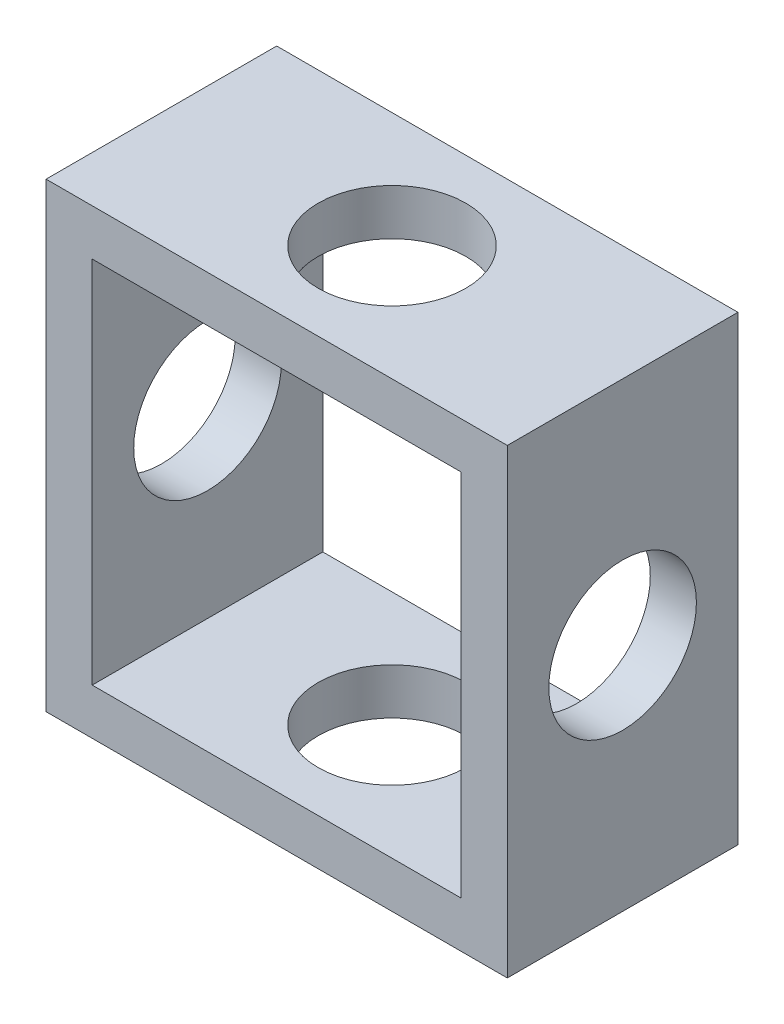
ISO-10303-21;
HEADER;
FILE_DESCRIPTION(('STEP AP214'),'2;1');
FILE_NAME('part.step','',(''),(''),'','','');
FILE_SCHEMA(('AUTOMOTIVE_DESIGN { 1 0 10303 214 1 1 1 1 }'));
ENDSEC;
DATA;
#1=APPLICATION_CONTEXT('core data for automotive mechanical design processes');
#2=APPLICATION_PROTOCOL_DEFINITION('international standard','automotive_design',2000,#1);
#3=PRODUCT_CONTEXT('',#1,'mechanical');
#4=PRODUCT('Part','Part','',(#3));
#5=PRODUCT_RELATED_PRODUCT_CATEGORY('part','',(#4));
#6=PRODUCT_DEFINITION_FORMATION('','',#4);
#7=PRODUCT_DEFINITION_CONTEXT('part definition',#1,'design');
#8=PRODUCT_DEFINITION('design','',#6,#7);
#9=PRODUCT_DEFINITION_SHAPE('','',#8);
#10=(LENGTH_UNIT() NAMED_UNIT(*) SI_UNIT(.MILLI.,.METRE.));
#11=(NAMED_UNIT(*) PLANE_ANGLE_UNIT() SI_UNIT($,.RADIAN.));
#12=(NAMED_UNIT(*) SI_UNIT($,.STERADIAN.) SOLID_ANGLE_UNIT());
#13=UNCERTAINTY_MEASURE_WITH_UNIT(LENGTH_MEASURE(1.E-05),#10,'distance_accuracy_value','');
#14=(GEOMETRIC_REPRESENTATION_CONTEXT(3) GLOBAL_UNCERTAINTY_ASSIGNED_CONTEXT((#13)) GLOBAL_UNIT_ASSIGNED_CONTEXT((#10,
#11,#12)) REPRESENTATION_CONTEXT('',''));
#15=CARTESIAN_POINT('',(0.,0.,0.));
#16=DIRECTION('',(0.,0.,1.));
#17=DIRECTION('',(1.,0.,0.));
#18=AXIS2_PLACEMENT_3D('',#15,#16,#17);
#19=CARTESIAN_POINT('',(0.,0.,25.));
#20=DIRECTION('',(0.,0.,1.));
#21=DIRECTION('',(1.,0.,0.));
#22=AXIS2_PLACEMENT_3D('',#19,#20,#21);
#23=PLANE('',#22);
#24=DIRECTION('',(0.,1.,0.));
#25=VECTOR('',#24,1.);
#26=CARTESIAN_POINT('',(25.,25.,25.));
#27=LINE('',#26,#25);
#28=CARTESIAN_POINT('',(25.,-25.,25.));
#29=VERTEX_POINT('',#28);
#30=CARTESIAN_POINT('',(25.,25.,25.));
#31=VERTEX_POINT('',#30);
#32=EDGE_CURVE('E147',#29,#31,#27,.T.);
#33=ORIENTED_EDGE('',*,*,#32,.T.);
#34=DIRECTION('',(-1.,0.,0.));
#35=VECTOR('',#34,1.);
#36=CARTESIAN_POINT('',(-25.,25.,25.));
#37=LINE('',#36,#35);
#38=CARTESIAN_POINT('',(-25.,25.,25.));
#39=VERTEX_POINT('',#38);
#40=EDGE_CURVE('E150',#31,#39,#37,.T.);
#41=ORIENTED_EDGE('',*,*,#40,.T.);
#42=DIRECTION('',(0.,-1.,0.));
#43=VECTOR('',#42,1.);
#44=CARTESIAN_POINT('',(-25.,25.,25.));
#45=LINE('',#44,#43);
#46=CARTESIAN_POINT('',(-25.,-25.,25.));
#47=VERTEX_POINT('',#46);
#48=EDGE_CURVE('E153',#39,#47,#45,.T.);
#49=ORIENTED_EDGE('',*,*,#48,.T.);
#50=DIRECTION('',(1.,0.,0.));
#51=VECTOR('',#50,1.);
#52=CARTESIAN_POINT('',(-25.,-25.,25.));
#53=LINE('',#52,#51);
#54=EDGE_CURVE('E155',#47,#29,#53,.T.);
#55=ORIENTED_EDGE('',*,*,#54,.T.);
#56=EDGE_LOOP('',(#33,#41,#49,#55));
#57=FACE_BOUND('',#56,.T.);
#58=DIRECTION('',(-1.,0.,0.));
#59=VECTOR('',#58,1.);
#60=CARTESIAN_POINT('',(-20.,20.,25.));
#61=LINE('',#60,#59);
#62=CARTESIAN_POINT('',(20.,20.,25.));
#63=VERTEX_POINT('',#62);
#64=CARTESIAN_POINT('',(-20.,20.,25.));
#65=VERTEX_POINT('',#64);
#66=EDGE_CURVE('E117',#63,#65,#61,.T.);
#67=ORIENTED_EDGE('',*,*,#66,.F.);
#68=DIRECTION('',(0.,1.,0.));
#69=VECTOR('',#68,1.);
#70=CARTESIAN_POINT('',(20.,20.,25.));
#71=LINE('',#70,#69);
#72=CARTESIAN_POINT('',(20.,-20.,25.));
#73=VERTEX_POINT('',#72);
#74=EDGE_CURVE('E109',#73,#63,#71,.T.);
#75=ORIENTED_EDGE('',*,*,#74,.F.);
#76=DIRECTION('',(1.,0.,0.));
#77=VECTOR('',#76,1.);
#78=CARTESIAN_POINT('',(-20.,-20.,25.));
#79=LINE('',#78,#77);
#80=CARTESIAN_POINT('',(-20.,-20.,25.));
#81=VERTEX_POINT('',#80);
#82=EDGE_CURVE('E131',#81,#73,#79,.T.);
#83=ORIENTED_EDGE('',*,*,#82,.F.);
#84=DIRECTION('',(0.,-1.,0.));
#85=VECTOR('',#84,1.);
#86=CARTESIAN_POINT('',(-20.,20.,25.));
#87=LINE('',#86,#85);
#88=EDGE_CURVE('E129',#65,#81,#87,.T.);
#89=ORIENTED_EDGE('',*,*,#88,.F.);
#90=EDGE_LOOP('',(#67,#75,#83,#89));
#91=FACE_BOUND('',#90,.T.);
#92=ADVANCED_FACE('F42',(#57,#91),#23,.T.);
#93=CARTESIAN_POINT('',(0.,0.,0.));
#94=DIRECTION('',(0.,0.,1.));
#95=DIRECTION('',(1.,0.,0.));
#96=AXIS2_PLACEMENT_3D('',#93,#94,#95);
#97=PLANE('',#96);
#98=DIRECTION('',(0.,1.,0.));
#99=VECTOR('',#98,1.);
#100=CARTESIAN_POINT('',(25.,25.,0.));
#101=LINE('',#100,#99);
#102=CARTESIAN_POINT('',(25.,-25.,0.));
#103=VERTEX_POINT('',#102);
#104=CARTESIAN_POINT('',(25.,25.,0.));
#105=VERTEX_POINT('',#104);
#106=EDGE_CURVE('E125',#103,#105,#101,.T.);
#107=ORIENTED_EDGE('',*,*,#106,.F.);
#108=DIRECTION('',(1.,0.,0.));
#109=VECTOR('',#108,1.);
#110=CARTESIAN_POINT('',(-25.,-25.,0.));
#111=LINE('',#110,#109);
#112=CARTESIAN_POINT('',(-25.,-25.,0.));
#113=VERTEX_POINT('',#112);
#114=EDGE_CURVE('E151',#113,#103,#111,.T.);
#115=ORIENTED_EDGE('',*,*,#114,.F.);
#116=DIRECTION('',(0.,-1.,0.));
#117=VECTOR('',#116,1.);
#118=CARTESIAN_POINT('',(-25.,25.,0.));
#119=LINE('',#118,#117);
#120=CARTESIAN_POINT('',(-25.,25.,0.));
#121=VERTEX_POINT('',#120);
#122=EDGE_CURVE('E162',#121,#113,#119,.T.);
#123=ORIENTED_EDGE('',*,*,#122,.F.);
#124=DIRECTION('',(-1.,0.,0.));
#125=VECTOR('',#124,1.);
#126=CARTESIAN_POINT('',(-25.,25.,0.));
#127=LINE('',#126,#125);
#128=EDGE_CURVE('E160',#105,#121,#127,.T.);
#129=ORIENTED_EDGE('',*,*,#128,.F.);
#130=EDGE_LOOP('',(#107,#115,#123,#129));
#131=FACE_BOUND('',#130,.T.);
#132=DIRECTION('',(0.,1.,0.));
#133=VECTOR('',#132,1.);
#134=CARTESIAN_POINT('',(20.,20.,0.));
#135=LINE('',#134,#133);
#136=CARTESIAN_POINT('',(20.,-20.,0.));
#137=VERTEX_POINT('',#136);
#138=CARTESIAN_POINT('',(20.,20.,0.));
#139=VERTEX_POINT('',#138);
#140=EDGE_CURVE('E67',#137,#139,#135,.T.);
#141=ORIENTED_EDGE('',*,*,#140,.T.);
#142=DIRECTION('',(-1.,0.,0.));
#143=VECTOR('',#142,1.);
#144=CARTESIAN_POINT('',(-20.,20.,0.));
#145=LINE('',#144,#143);
#146=CARTESIAN_POINT('',(-20.,20.,0.));
#147=VERTEX_POINT('',#146);
#148=EDGE_CURVE('E124',#139,#147,#145,.T.);
#149=ORIENTED_EDGE('',*,*,#148,.T.);
#150=DIRECTION('',(0.,-1.,0.));
#151=VECTOR('',#150,1.);
#152=CARTESIAN_POINT('',(-20.,20.,0.));
#153=LINE('',#152,#151);
#154=CARTESIAN_POINT('',(-20.,-20.,0.));
#155=VERTEX_POINT('',#154);
#156=EDGE_CURVE('E139',#147,#155,#153,.T.);
#157=ORIENTED_EDGE('',*,*,#156,.T.);
#158=DIRECTION('',(1.,0.,0.));
#159=VECTOR('',#158,1.);
#160=CARTESIAN_POINT('',(-20.,-20.,0.));
#161=LINE('',#160,#159);
#162=EDGE_CURVE('E118',#155,#137,#161,.T.);
#163=ORIENTED_EDGE('',*,*,#162,.T.);
#164=EDGE_LOOP('',(#141,#149,#157,#163));
#165=FACE_BOUND('',#164,.T.);
#166=ADVANCED_FACE('F210',(#131,#165),#97,.F.);
#167=CARTESIAN_POINT('',(25.,25.,25.));
#168=DIRECTION('',(-1.,0.,0.));
#169=DIRECTION('',(0.,-1.,0.));
#170=AXIS2_PLACEMENT_3D('',#167,#168,#169);
#171=PLANE('',#170);
#172=CARTESIAN_POINT('',(25.,0.,12.5));
#173=DIRECTION('',(1.,0.,0.));
#174=DIRECTION('',(0.,1.,0.));
#175=AXIS2_PLACEMENT_3D('',#172,#173,#174);
#176=CIRCLE('',#175,8.);
#177=CARTESIAN_POINT('',(25.,8.,12.5));
#178=VERTEX_POINT('',#177);
#179=EDGE_CURVE('E259',#178,#178,#176,.T.);
#180=ORIENTED_EDGE('',*,*,#179,.F.);
#181=EDGE_LOOP('',(#180));
#182=FACE_BOUND('',#181,.T.);
#183=ORIENTED_EDGE('',*,*,#106,.T.);
#184=DIRECTION('',(0.,0.,-1.));
#185=VECTOR('',#184,1.);
#186=CARTESIAN_POINT('',(25.,25.,25.));
#187=LINE('',#186,#185);
#188=EDGE_CURVE('E11',#31,#105,#187,.T.);
#189=ORIENTED_EDGE('',*,*,#188,.F.);
#190=ORIENTED_EDGE('',*,*,#32,.F.);
#191=DIRECTION('',(0.,0.,-1.));
#192=VECTOR('',#191,1.);
#193=CARTESIAN_POINT('',(25.,-25.,25.));
#194=LINE('',#193,#192);
#195=EDGE_CURVE('E157',#29,#103,#194,.T.);
#196=ORIENTED_EDGE('',*,*,#195,.T.);
#197=EDGE_LOOP('',(#183,#189,#190,#196));
#198=FACE_BOUND('',#197,.T.);
#199=ADVANCED_FACE('F44',(#182,#198),#171,.F.);
#200=CARTESIAN_POINT('',(-25.,25.,25.));
#201=DIRECTION('',(0.,-1.,0.));
#202=DIRECTION('',(0.,0.,-1.));
#203=AXIS2_PLACEMENT_3D('',#200,#201,#202);
#204=PLANE('',#203);
#205=CARTESIAN_POINT('',(0.,25.,12.5));
#206=DIRECTION('',(0.,1.,0.));
#207=DIRECTION('',(0.,0.,1.));
#208=AXIS2_PLACEMENT_3D('',#205,#206,#207);
#209=CIRCLE('',#208,8.);
#210=CARTESIAN_POINT('',(0.,25.,20.5));
#211=VERTEX_POINT('',#210);
#212=EDGE_CURVE('E174',#211,#211,#209,.T.);
#213=ORIENTED_EDGE('',*,*,#212,.F.);
#214=EDGE_LOOP('',(#213));
#215=FACE_BOUND('',#214,.T.);
#216=ORIENTED_EDGE('',*,*,#128,.T.);
#217=DIRECTION('',(0.,0.,-1.));
#218=VECTOR('',#217,1.);
#219=CARTESIAN_POINT('',(-25.,25.,25.));
#220=LINE('',#219,#218);
#221=EDGE_CURVE('E51',#39,#121,#220,.T.);
#222=ORIENTED_EDGE('',*,*,#221,.F.);
#223=ORIENTED_EDGE('',*,*,#40,.F.);
#224=ORIENTED_EDGE('',*,*,#188,.T.);
#225=EDGE_LOOP('',(#216,#222,#223,#224));
#226=FACE_BOUND('',#225,.T.);
#227=ADVANCED_FACE('F225',(#215,#226),#204,.F.);
#228=CARTESIAN_POINT('',(-25.,25.,25.));
#229=DIRECTION('',(1.,0.,0.));
#230=DIRECTION('',(0.,1.,0.));
#231=AXIS2_PLACEMENT_3D('',#228,#229,#230);
#232=PLANE('',#231);
#233=CARTESIAN_POINT('',(-25.,0.,12.5));
#234=DIRECTION('',(1.,0.,0.));
#235=DIRECTION('',(0.,1.,0.));
#236=AXIS2_PLACEMENT_3D('',#233,#234,#235);
#237=CIRCLE('',#236,8.);
#238=CARTESIAN_POINT('',(-25.,8.,12.5));
#239=VERTEX_POINT('',#238);
#240=EDGE_CURVE('E180',#239,#239,#237,.T.);
#241=ORIENTED_EDGE('',*,*,#240,.T.);
#242=EDGE_LOOP('',(#241));
#243=FACE_BOUND('',#242,.T.);
#244=ORIENTED_EDGE('',*,*,#122,.T.);
#245=DIRECTION('',(0.,0.,-1.));
#246=VECTOR('',#245,1.);
#247=CARTESIAN_POINT('',(-25.,-25.,25.));
#248=LINE('',#247,#246);
#249=EDGE_CURVE('E167',#47,#113,#248,.T.);
#250=ORIENTED_EDGE('',*,*,#249,.F.);
#251=ORIENTED_EDGE('',*,*,#48,.F.);
#252=ORIENTED_EDGE('',*,*,#221,.T.);
#253=EDGE_LOOP('',(#244,#250,#251,#252));
#254=FACE_BOUND('',#253,.T.);
#255=ADVANCED_FACE('F223',(#243,#254),#232,.F.);
#256=CARTESIAN_POINT('',(-25.,-25.,25.));
#257=DIRECTION('',(0.,1.,0.));
#258=DIRECTION('',(0.,0.,1.));
#259=AXIS2_PLACEMENT_3D('',#256,#257,#258);
#260=PLANE('',#259);
#261=CARTESIAN_POINT('',(0.,-25.,12.5));
#262=DIRECTION('',(0.,1.,0.));
#263=DIRECTION('',(0.,0.,1.));
#264=AXIS2_PLACEMENT_3D('',#261,#262,#263);
#265=CIRCLE('',#264,8.);
#266=CARTESIAN_POINT('',(0.,-25.,20.5));
#267=VERTEX_POINT('',#266);
#268=EDGE_CURVE('E137',#267,#267,#265,.T.);
#269=ORIENTED_EDGE('',*,*,#268,.T.);
#270=EDGE_LOOP('',(#269));
#271=FACE_BOUND('',#270,.T.);
#272=ORIENTED_EDGE('',*,*,#114,.T.);
#273=ORIENTED_EDGE('',*,*,#195,.F.);
#274=ORIENTED_EDGE('',*,*,#54,.F.);
#275=ORIENTED_EDGE('',*,*,#249,.T.);
#276=EDGE_LOOP('',(#272,#273,#274,#275));
#277=FACE_BOUND('',#276,.T.);
#278=ADVANCED_FACE('F191',(#271,#277),#260,.F.);
#279=CARTESIAN_POINT('',(20.,20.,25.));
#280=DIRECTION('',(-1.,0.,0.));
#281=DIRECTION('',(0.,-1.,0.));
#282=AXIS2_PLACEMENT_3D('',#279,#280,#281);
#283=PLANE('',#282);
#284=CARTESIAN_POINT('',(20.,0.,12.5));
#285=DIRECTION('',(-1.,0.,0.));
#286=DIRECTION('',(0.,-1.,0.));
#287=AXIS2_PLACEMENT_3D('',#284,#285,#286);
#288=CIRCLE('',#287,8.);
#289=CARTESIAN_POINT('',(20.,8.,12.5));
#290=VERTEX_POINT('',#289);
#291=EDGE_CURVE('E185',#290,#290,#288,.T.);
#292=ORIENTED_EDGE('',*,*,#291,.F.);
#293=EDGE_LOOP('',(#292));
#294=FACE_BOUND('',#293,.T.);
#295=ORIENTED_EDGE('',*,*,#140,.F.);
#296=DIRECTION('',(0.,0.,-1.));
#297=VECTOR('',#296,1.);
#298=CARTESIAN_POINT('',(20.,-20.,25.));
#299=LINE('',#298,#297);
#300=EDGE_CURVE('E113',#73,#137,#299,.T.);
#301=ORIENTED_EDGE('',*,*,#300,.F.);
#302=ORIENTED_EDGE('',*,*,#74,.T.);
#303=DIRECTION('',(0.,0.,-1.));
#304=VECTOR('',#303,1.);
#305=CARTESIAN_POINT('',(20.,20.,25.));
#306=LINE('',#305,#304);
#307=EDGE_CURVE('E112',#63,#139,#306,.T.);
#308=ORIENTED_EDGE('',*,*,#307,.T.);
#309=EDGE_LOOP('',(#295,#301,#302,#308));
#310=FACE_BOUND('',#309,.T.);
#311=ADVANCED_FACE('F111',(#294,#310),#283,.T.);
#312=CARTESIAN_POINT('',(-20.,20.,25.));
#313=DIRECTION('',(0.,-1.,0.));
#314=DIRECTION('',(0.,0.,-1.));
#315=AXIS2_PLACEMENT_3D('',#312,#313,#314);
#316=PLANE('',#315);
#317=CARTESIAN_POINT('',(0.,20.,12.5));
#318=DIRECTION('',(0.,-1.,0.));
#319=DIRECTION('',(0.,0.,-1.));
#320=AXIS2_PLACEMENT_3D('',#317,#318,#319);
#321=CIRCLE('',#320,8.);
#322=CARTESIAN_POINT('',(0.,20.,20.5));
#323=VERTEX_POINT('',#322);
#324=EDGE_CURVE('E173',#323,#323,#321,.T.);
#325=ORIENTED_EDGE('',*,*,#324,.F.);
#326=EDGE_LOOP('',(#325));
#327=FACE_BOUND('',#326,.T.);
#328=ORIENTED_EDGE('',*,*,#148,.F.);
#329=ORIENTED_EDGE('',*,*,#307,.F.);
#330=ORIENTED_EDGE('',*,*,#66,.T.);
#331=DIRECTION('',(0.,0.,-1.));
#332=VECTOR('',#331,1.);
#333=CARTESIAN_POINT('',(-20.,20.,25.));
#334=LINE('',#333,#332);
#335=EDGE_CURVE('E126',#65,#147,#334,.T.);
#336=ORIENTED_EDGE('',*,*,#335,.T.);
#337=EDGE_LOOP('',(#328,#329,#330,#336));
#338=FACE_BOUND('',#337,.T.);
#339=ADVANCED_FACE('F121',(#327,#338),#316,.T.);
#340=CARTESIAN_POINT('',(-20.,20.,25.));
#341=DIRECTION('',(1.,0.,0.));
#342=DIRECTION('',(0.,1.,0.));
#343=AXIS2_PLACEMENT_3D('',#340,#341,#342);
#344=PLANE('',#343);
#345=CARTESIAN_POINT('',(-20.,0.,12.5));
#346=DIRECTION('',(1.,0.,0.));
#347=DIRECTION('',(0.,1.,0.));
#348=AXIS2_PLACEMENT_3D('',#345,#346,#347);
#349=CIRCLE('',#348,8.);
#350=CARTESIAN_POINT('',(-20.,8.,12.5));
#351=VERTEX_POINT('',#350);
#352=EDGE_CURVE('E46',#351,#351,#349,.T.);
#353=ORIENTED_EDGE('',*,*,#352,.F.);
#354=EDGE_LOOP('',(#353));
#355=FACE_BOUND('',#354,.T.);
#356=ORIENTED_EDGE('',*,*,#156,.F.);
#357=ORIENTED_EDGE('',*,*,#335,.F.);
#358=ORIENTED_EDGE('',*,*,#88,.T.);
#359=DIRECTION('',(0.,0.,-1.));
#360=VECTOR('',#359,1.);
#361=CARTESIAN_POINT('',(-20.,-20.,25.));
#362=LINE('',#361,#360);
#363=EDGE_CURVE('E59',#81,#155,#362,.T.);
#364=ORIENTED_EDGE('',*,*,#363,.T.);
#365=EDGE_LOOP('',(#356,#357,#358,#364));
#366=FACE_BOUND('',#365,.T.);
#367=ADVANCED_FACE('F205',(#355,#366),#344,.T.);
#368=CARTESIAN_POINT('',(-20.,-20.,25.));
#369=DIRECTION('',(0.,1.,0.));
#370=DIRECTION('',(0.,0.,1.));
#371=AXIS2_PLACEMENT_3D('',#368,#369,#370);
#372=PLANE('',#371);
#373=CARTESIAN_POINT('',(0.,-20.,12.5));
#374=DIRECTION('',(0.,1.,0.));
#375=DIRECTION('',(0.,0.,1.));
#376=AXIS2_PLACEMENT_3D('',#373,#374,#375);
#377=CIRCLE('',#376,8.);
#378=CARTESIAN_POINT('',(0.,-20.,20.5));
#379=VERTEX_POINT('',#378);
#380=EDGE_CURVE('E171',#379,#379,#377,.T.);
#381=ORIENTED_EDGE('',*,*,#380,.F.);
#382=EDGE_LOOP('',(#381));
#383=FACE_BOUND('',#382,.T.);
#384=ORIENTED_EDGE('',*,*,#162,.F.);
#385=ORIENTED_EDGE('',*,*,#363,.F.);
#386=ORIENTED_EDGE('',*,*,#82,.T.);
#387=ORIENTED_EDGE('',*,*,#300,.T.);
#388=EDGE_LOOP('',(#384,#385,#386,#387));
#389=FACE_BOUND('',#388,.T.);
#390=ADVANCED_FACE('F197',(#383,#389),#372,.T.);
#391=CARTESIAN_POINT('',(0.,-35.,12.5));
#392=DIRECTION('',(0.,1.,0.));
#393=DIRECTION('',(0.,0.,1.));
#394=AXIS2_PLACEMENT_3D('',#391,#392,#393);
#395=CYLINDRICAL_SURFACE('',#394,8.);
#396=CARTESIAN_POINT('',(0.,-20.,20.5));
#397=CARTESIAN_POINT('',(0.,-20.0520833333333,20.5));
#398=CARTESIAN_POINT('',(0.,-20.1041666666667,20.5));
#399=CARTESIAN_POINT('',(0.,-20.2083333333333,20.5));
#400=CARTESIAN_POINT('',(0.,-20.2604166666667,20.5));
#401=CARTESIAN_POINT('',(0.,-20.3645833333333,20.5));
#402=CARTESIAN_POINT('',(0.,-20.4166666666667,20.5));
#403=CARTESIAN_POINT('',(0.,-20.5208333333333,20.5));
#404=CARTESIAN_POINT('',(0.,-20.5729166666667,20.5));
#405=CARTESIAN_POINT('',(0.,-20.6770833333333,20.5));
#406=CARTESIAN_POINT('',(0.,-20.7291666666667,20.5));
#407=CARTESIAN_POINT('',(0.,-20.8333333333333,20.5));
#408=CARTESIAN_POINT('',(0.,-20.8854166666667,20.5));
#409=CARTESIAN_POINT('',(0.,-20.9895833333333,20.5));
#410=CARTESIAN_POINT('',(0.,-21.0416666666667,20.5));
#411=CARTESIAN_POINT('',(0.,-21.1458333333333,20.5));
#412=CARTESIAN_POINT('',(0.,-21.1979166666667,20.5));
#413=CARTESIAN_POINT('',(0.,-21.3020833333333,20.5));
#414=CARTESIAN_POINT('',(0.,-21.3541666666667,20.5));
#415=CARTESIAN_POINT('',(0.,-21.4583333333333,20.5));
#416=CARTESIAN_POINT('',(0.,-21.5104166666667,20.5));
#417=CARTESIAN_POINT('',(0.,-21.6145833333333,20.5));
#418=CARTESIAN_POINT('',(0.,-21.6666666666667,20.5));
#419=CARTESIAN_POINT('',(0.,-21.7708333333333,20.5));
#420=CARTESIAN_POINT('',(0.,-21.8229166666667,20.5));
#421=CARTESIAN_POINT('',(0.,-21.9270833333333,20.5));
#422=CARTESIAN_POINT('',(0.,-21.9791666666667,20.5));
#423=CARTESIAN_POINT('',(0.,-22.0833333333333,20.5));
#424=CARTESIAN_POINT('',(0.,-22.1354166666667,20.5));
#425=CARTESIAN_POINT('',(0.,-22.2395833333333,20.5));
#426=CARTESIAN_POINT('',(0.,-22.2916666666667,20.5));
#427=CARTESIAN_POINT('',(0.,-22.3958333333333,20.5));
#428=CARTESIAN_POINT('',(0.,-22.4479166666667,20.5));
#429=CARTESIAN_POINT('',(0.,-22.5520833333333,20.5));
#430=CARTESIAN_POINT('',(0.,-22.6041666666667,20.5));
#431=CARTESIAN_POINT('',(0.,-22.7083333333333,20.5));
#432=CARTESIAN_POINT('',(0.,-22.7604166666667,20.5));
#433=CARTESIAN_POINT('',(0.,-22.8645833333333,20.5));
#434=CARTESIAN_POINT('',(0.,-22.9166666666667,20.5));
#435=CARTESIAN_POINT('',(0.,-23.0208333333333,20.5));
#436=CARTESIAN_POINT('',(0.,-23.0729166666667,20.5));
#437=CARTESIAN_POINT('',(0.,-23.1770833333333,20.5));
#438=CARTESIAN_POINT('',(0.,-23.2291666666667,20.5));
#439=CARTESIAN_POINT('',(0.,-23.3333333333333,20.5));
#440=CARTESIAN_POINT('',(0.,-23.3854166666667,20.5));
#441=CARTESIAN_POINT('',(0.,-23.4895833333333,20.5));
#442=CARTESIAN_POINT('',(0.,-23.5416666666667,20.5));
#443=CARTESIAN_POINT('',(0.,-23.6458333333333,20.5));
#444=CARTESIAN_POINT('',(0.,-23.6979166666667,20.5));
#445=CARTESIAN_POINT('',(0.,-23.8020833333333,20.5));
#446=CARTESIAN_POINT('',(0.,-23.8541666666667,20.5));
#447=CARTESIAN_POINT('',(0.,-23.9583333333333,20.5));
#448=CARTESIAN_POINT('',(0.,-24.0104166666667,20.5));
#449=CARTESIAN_POINT('',(0.,-24.1145833333333,20.5));
#450=CARTESIAN_POINT('',(0.,-24.1666666666667,20.5));
#451=CARTESIAN_POINT('',(0.,-24.2708333333333,20.5));
#452=CARTESIAN_POINT('',(0.,-24.3229166666667,20.5));
#453=CARTESIAN_POINT('',(0.,-24.4270833333333,20.5));
#454=CARTESIAN_POINT('',(0.,-24.4791666666667,20.5));
#455=CARTESIAN_POINT('',(0.,-24.5833333333333,20.5));
#456=CARTESIAN_POINT('',(0.,-24.6354166666667,20.5));
#457=CARTESIAN_POINT('',(0.,-24.7395833333333,20.5));
#458=CARTESIAN_POINT('',(0.,-24.7916666666667,20.5));
#459=CARTESIAN_POINT('',(0.,-24.8958333333333,20.5));
#460=CARTESIAN_POINT('',(0.,-24.9479166666667,20.5));
#461=CARTESIAN_POINT('',(0.,-25.,20.5));
#462=B_SPLINE_CURVE_WITH_KNOTS('',3,(#396,#397,#398,#399,#400,#401,#402,#403,#404,#405,#406,
#407,#408,#409,#410,#411,#412,#413,#414,#415,#416,#417,#418,#419,#420,#421,#422,#423,#424,#425,
#426,#427,#428,#429,#430,#431,#432,#433,#434,#435,#436,#437,#438,#439,#440,#441,#442,#443,#444,
#445,#446,#447,#448,#449,#450,#451,#452,#453,#454,#455,#456,#457,#458,#459,#460,#461),
.UNSPECIFIED.,.F.,.F.,(4,2,2,2,2,2,2,2,2,2,2,2,2,2,2,2,2,2,2,2,2,2,2,2,2,2,2,2,2,2,2,2,4),(0.,
0.156249999999997,0.312499999999997,0.468749999999997,0.624999999999997,0.781249999999997,
0.937499999999994,1.09375,1.24999999999999,1.40624999999999,1.56249999999999,1.71874999999999,
1.87499999999999,2.03124999999999,2.1875,2.34374999999999,2.49999999999999,2.65624999999999,
2.81249999999999,2.96874999999999,3.12499999999999,3.28124999999999,3.43749999999999,
3.59374999999999,3.74999999999999,3.90624999999999,4.06249999999999,4.21874999999999,
4.37499999999999,4.53124999999999,4.68749999999998,4.84374999999999,4.99999999999998),.UNSPECIFIED.);
#463=EDGE_CURVE('BSEAM194',#379,#267,#462,.T.);
#464=ORIENTED_EDGE('',*,*,#380,.T.);
#465=ORIENTED_EDGE('',*,*,#268,.F.);
#466=ORIENTED_EDGE('',*,*,#463,.T.);
#467=ORIENTED_EDGE('',*,*,#463,.F.);
#468=EDGE_LOOP('',(#464,#466,#465,#467));
#469=FACE_BOUND('',#468,.T.);
#470=ADVANCED_FACE('F194',(#469),#395,.F.);
#471=CARTESIAN_POINT('',(0.,20.,20.5));
#472=CARTESIAN_POINT('',(0.,20.0520833333333,20.5));
#473=CARTESIAN_POINT('',(0.,20.1041666666667,20.5));
#474=CARTESIAN_POINT('',(0.,20.2083333333333,20.5));
#475=CARTESIAN_POINT('',(0.,20.2604166666667,20.5));
#476=CARTESIAN_POINT('',(0.,20.3645833333333,20.5));
#477=CARTESIAN_POINT('',(0.,20.4166666666667,20.5));
#478=CARTESIAN_POINT('',(0.,20.5208333333333,20.5));
#479=CARTESIAN_POINT('',(0.,20.5729166666667,20.5));
#480=CARTESIAN_POINT('',(0.,20.6770833333333,20.5));
#481=CARTESIAN_POINT('',(0.,20.7291666666667,20.5));
#482=CARTESIAN_POINT('',(0.,20.8333333333333,20.5));
#483=CARTESIAN_POINT('',(0.,20.8854166666667,20.5));
#484=CARTESIAN_POINT('',(0.,20.9895833333333,20.5));
#485=CARTESIAN_POINT('',(0.,21.0416666666667,20.5));
#486=CARTESIAN_POINT('',(0.,21.1458333333333,20.5));
#487=CARTESIAN_POINT('',(0.,21.1979166666667,20.5));
#488=CARTESIAN_POINT('',(0.,21.3020833333333,20.5));
#489=CARTESIAN_POINT('',(0.,21.3541666666667,20.5));
#490=CARTESIAN_POINT('',(0.,21.4583333333333,20.5));
#491=CARTESIAN_POINT('',(0.,21.5104166666667,20.5));
#492=CARTESIAN_POINT('',(0.,21.6145833333333,20.5));
#493=CARTESIAN_POINT('',(0.,21.6666666666667,20.5));
#494=CARTESIAN_POINT('',(0.,21.7708333333333,20.5));
#495=CARTESIAN_POINT('',(0.,21.8229166666667,20.5));
#496=CARTESIAN_POINT('',(0.,21.9270833333333,20.5));
#497=CARTESIAN_POINT('',(0.,21.9791666666667,20.5));
#498=CARTESIAN_POINT('',(0.,22.0833333333333,20.5));
#499=CARTESIAN_POINT('',(0.,22.1354166666667,20.5));
#500=CARTESIAN_POINT('',(0.,22.2395833333333,20.5));
#501=CARTESIAN_POINT('',(0.,22.2916666666667,20.5));
#502=CARTESIAN_POINT('',(0.,22.3958333333333,20.5));
#503=CARTESIAN_POINT('',(0.,22.4479166666667,20.5));
#504=CARTESIAN_POINT('',(0.,22.5520833333333,20.5));
#505=CARTESIAN_POINT('',(0.,22.6041666666667,20.5));
#506=CARTESIAN_POINT('',(0.,22.7083333333333,20.5));
#507=CARTESIAN_POINT('',(0.,22.7604166666667,20.5));
#508=CARTESIAN_POINT('',(0.,22.8645833333333,20.5));
#509=CARTESIAN_POINT('',(0.,22.9166666666667,20.5));
#510=CARTESIAN_POINT('',(0.,23.0208333333333,20.5));
#511=CARTESIAN_POINT('',(0.,23.0729166666667,20.5));
#512=CARTESIAN_POINT('',(0.,23.1770833333333,20.5));
#513=CARTESIAN_POINT('',(0.,23.2291666666667,20.5));
#514=CARTESIAN_POINT('',(0.,23.3333333333333,20.5));
#515=CARTESIAN_POINT('',(0.,23.3854166666667,20.5));
#516=CARTESIAN_POINT('',(0.,23.4895833333333,20.5));
#517=CARTESIAN_POINT('',(0.,23.5416666666667,20.5));
#518=CARTESIAN_POINT('',(0.,23.6458333333333,20.5));
#519=CARTESIAN_POINT('',(0.,23.6979166666667,20.5));
#520=CARTESIAN_POINT('',(0.,23.8020833333333,20.5));
#521=CARTESIAN_POINT('',(0.,23.8541666666667,20.5));
#522=CARTESIAN_POINT('',(0.,23.9583333333333,20.5));
#523=CARTESIAN_POINT('',(0.,24.0104166666667,20.5));
#524=CARTESIAN_POINT('',(0.,24.1145833333333,20.5));
#525=CARTESIAN_POINT('',(0.,24.1666666666667,20.5));
#526=CARTESIAN_POINT('',(0.,24.2708333333333,20.5));
#527=CARTESIAN_POINT('',(0.,24.3229166666667,20.5));
#528=CARTESIAN_POINT('',(0.,24.4270833333333,20.5));
#529=CARTESIAN_POINT('',(0.,24.4791666666667,20.5));
#530=CARTESIAN_POINT('',(0.,24.5833333333333,20.5));
#531=CARTESIAN_POINT('',(0.,24.6354166666667,20.5));
#532=CARTESIAN_POINT('',(0.,24.7395833333333,20.5));
#533=CARTESIAN_POINT('',(0.,24.7916666666667,20.5));
#534=CARTESIAN_POINT('',(0.,24.8958333333333,20.5));
#535=CARTESIAN_POINT('',(0.,24.9479166666667,20.5));
#536=CARTESIAN_POINT('',(0.,25.,20.5));
#537=B_SPLINE_CURVE_WITH_KNOTS('',3,(#471,#472,#473,#474,#475,#476,#477,#478,#479,#480,#481,
#482,#483,#484,#485,#486,#487,#488,#489,#490,#491,#492,#493,#494,#495,#496,#497,#498,#499,#500,
#501,#502,#503,#504,#505,#506,#507,#508,#509,#510,#511,#512,#513,#514,#515,#516,#517,#518,#519,
#520,#521,#522,#523,#524,#525,#526,#527,#528,#529,#530,#531,#532,#533,#534,#535,#536),
.UNSPECIFIED.,.F.,.F.,(4,2,2,2,2,2,2,2,2,2,2,2,2,2,2,2,2,2,2,2,2,2,2,2,2,2,2,2,2,2,2,2,4),(0.,
0.156249999999997,0.3125,0.468750000000004,0.625000000000001,0.781249999999997,
0.937500000000001,1.09375,1.25,1.40625,1.5625,1.71875,1.875,2.03125,2.1875,2.34375000000001,2.5,
2.65625,2.8125,2.96875000000001,3.125,3.28125,3.4375,3.59375000000001,3.75,3.90625,4.0625,
4.21875000000001,4.375,4.53125,4.6875,4.84375000000001,5.),.UNSPECIFIED.);
#538=EDGE_CURVE('BSEAM196',#323,#211,#537,.T.);
#539=ORIENTED_EDGE('',*,*,#324,.T.);
#540=ORIENTED_EDGE('',*,*,#212,.T.);
#541=ORIENTED_EDGE('',*,*,#538,.T.);
#542=ORIENTED_EDGE('',*,*,#538,.F.);
#543=EDGE_LOOP('',(#539,#541,#540,#542));
#544=FACE_BOUND('',#543,.T.);
#545=ADVANCED_FACE('F196',(#544),#395,.F.);
#546=CARTESIAN_POINT('',(-35.,0.,12.5));
#547=DIRECTION('',(1.,0.,0.));
#548=DIRECTION('',(0.,1.,0.));
#549=AXIS2_PLACEMENT_3D('',#546,#547,#548);
#550=CYLINDRICAL_SURFACE('',#549,8.);
#551=CARTESIAN_POINT('',(-20.,8.,12.5));
#552=CARTESIAN_POINT('',(-20.0520833333333,8.,12.5));
#553=CARTESIAN_POINT('',(-20.1041666666667,8.,12.5));
#554=CARTESIAN_POINT('',(-20.2083333333333,8.,12.5));
#555=CARTESIAN_POINT('',(-20.2604166666667,8.,12.5));
#556=CARTESIAN_POINT('',(-20.3645833333333,8.,12.5));
#557=CARTESIAN_POINT('',(-20.4166666666667,8.,12.5));
#558=CARTESIAN_POINT('',(-20.5208333333333,8.,12.5));
#559=CARTESIAN_POINT('',(-20.5729166666667,8.,12.5));
#560=CARTESIAN_POINT('',(-20.6770833333333,8.,12.5));
#561=CARTESIAN_POINT('',(-20.7291666666667,8.,12.5));
#562=CARTESIAN_POINT('',(-20.8333333333333,8.,12.5));
#563=CARTESIAN_POINT('',(-20.8854166666667,8.,12.5));
#564=CARTESIAN_POINT('',(-20.9895833333333,8.,12.5));
#565=CARTESIAN_POINT('',(-21.0416666666667,8.,12.5));
#566=CARTESIAN_POINT('',(-21.1458333333333,8.,12.5));
#567=CARTESIAN_POINT('',(-21.1979166666667,8.,12.5));
#568=CARTESIAN_POINT('',(-21.3020833333333,8.,12.5));
#569=CARTESIAN_POINT('',(-21.3541666666667,8.,12.5));
#570=CARTESIAN_POINT('',(-21.4583333333333,8.,12.5));
#571=CARTESIAN_POINT('',(-21.5104166666667,8.,12.5));
#572=CARTESIAN_POINT('',(-21.6145833333333,8.,12.5));
#573=CARTESIAN_POINT('',(-21.6666666666667,8.,12.5));
#574=CARTESIAN_POINT('',(-21.7708333333333,8.,12.5));
#575=CARTESIAN_POINT('',(-21.8229166666667,8.,12.5));
#576=CARTESIAN_POINT('',(-21.9270833333333,8.,12.5));
#577=CARTESIAN_POINT('',(-21.9791666666667,8.,12.5));
#578=CARTESIAN_POINT('',(-22.0833333333333,8.,12.5));
#579=CARTESIAN_POINT('',(-22.1354166666667,8.,12.5));
#580=CARTESIAN_POINT('',(-22.2395833333333,8.,12.5));
#581=CARTESIAN_POINT('',(-22.2916666666667,8.,12.5));
#582=CARTESIAN_POINT('',(-22.3958333333333,8.,12.5));
#583=CARTESIAN_POINT('',(-22.4479166666667,8.,12.5));
#584=CARTESIAN_POINT('',(-22.5520833333333,8.,12.5));
#585=CARTESIAN_POINT('',(-22.6041666666667,8.,12.5));
#586=CARTESIAN_POINT('',(-22.7083333333333,8.,12.5));
#587=CARTESIAN_POINT('',(-22.7604166666667,8.,12.5));
#588=CARTESIAN_POINT('',(-22.8645833333333,8.,12.5));
#589=CARTESIAN_POINT('',(-22.9166666666667,8.,12.5));
#590=CARTESIAN_POINT('',(-23.0208333333333,8.,12.5));
#591=CARTESIAN_POINT('',(-23.0729166666667,8.,12.5));
#592=CARTESIAN_POINT('',(-23.1770833333333,8.,12.5));
#593=CARTESIAN_POINT('',(-23.2291666666667,8.,12.5));
#594=CARTESIAN_POINT('',(-23.3333333333333,8.,12.5));
#595=CARTESIAN_POINT('',(-23.3854166666667,8.,12.5));
#596=CARTESIAN_POINT('',(-23.4895833333333,8.,12.5));
#597=CARTESIAN_POINT('',(-23.5416666666667,8.,12.5));
#598=CARTESIAN_POINT('',(-23.6458333333333,8.,12.5));
#599=CARTESIAN_POINT('',(-23.6979166666667,8.,12.5));
#600=CARTESIAN_POINT('',(-23.8020833333333,8.,12.5));
#601=CARTESIAN_POINT('',(-23.8541666666667,8.,12.5));
#602=CARTESIAN_POINT('',(-23.9583333333333,8.,12.5));
#603=CARTESIAN_POINT('',(-24.0104166666667,8.,12.5));
#604=CARTESIAN_POINT('',(-24.1145833333333,8.,12.5));
#605=CARTESIAN_POINT('',(-24.1666666666667,8.,12.5));
#606=CARTESIAN_POINT('',(-24.2708333333333,8.,12.5));
#607=CARTESIAN_POINT('',(-24.3229166666667,8.,12.5));
#608=CARTESIAN_POINT('',(-24.4270833333333,8.,12.5));
#609=CARTESIAN_POINT('',(-24.4791666666667,8.,12.5));
#610=CARTESIAN_POINT('',(-24.5833333333333,8.,12.5));
#611=CARTESIAN_POINT('',(-24.6354166666667,8.,12.5));
#612=CARTESIAN_POINT('',(-24.7395833333333,8.,12.5));
#613=CARTESIAN_POINT('',(-24.7916666666667,8.,12.5));
#614=CARTESIAN_POINT('',(-24.8958333333333,8.,12.5));
#615=CARTESIAN_POINT('',(-24.9479166666667,8.,12.5));
#616=CARTESIAN_POINT('',(-25.,8.,12.5));
#617=B_SPLINE_CURVE_WITH_KNOTS('',3,(#551,#552,#553,#554,#555,#556,#557,#558,#559,#560,#561,
#562,#563,#564,#565,#566,#567,#568,#569,#570,#571,#572,#573,#574,#575,#576,#577,#578,#579,#580,
#581,#582,#583,#584,#585,#586,#587,#588,#589,#590,#591,#592,#593,#594,#595,#596,#597,#598,#599,
#600,#601,#602,#603,#604,#605,#606,#607,#608,#609,#610,#611,#612,#613,#614,#615,#616),
.UNSPECIFIED.,.F.,.F.,(4,2,2,2,2,2,2,2,2,2,2,2,2,2,2,2,2,2,2,2,2,2,2,2,2,2,2,2,2,2,2,2,4),(0.,
0.156250000000004,0.3125,0.468750000000004,0.625000000000001,0.781250000000004,
0.937500000000001,1.09375,1.25,1.40625,1.5625,1.71875,1.875,2.03125000000001,2.1875,
2.34375000000001,2.5,2.65625000000001,2.8125,2.96875000000001,3.125,3.28125000000001,3.4375,
3.59375000000001,3.75,3.90625000000001,4.0625,4.21875000000001,4.375,4.53125000000001,4.6875,
4.84375000000001,5.),.UNSPECIFIED.);
#618=EDGE_CURVE('BSEAM203',#351,#239,#617,.T.);
#619=ORIENTED_EDGE('',*,*,#352,.T.);
#620=ORIENTED_EDGE('',*,*,#240,.F.);
#621=ORIENTED_EDGE('',*,*,#618,.T.);
#622=ORIENTED_EDGE('',*,*,#618,.F.);
#623=EDGE_LOOP('',(#619,#621,#620,#622));
#624=FACE_BOUND('',#623,.T.);
#625=ADVANCED_FACE('F203',(#624),#550,.F.);
#626=CARTESIAN_POINT('',(20.,8.,12.5));
#627=CARTESIAN_POINT('',(20.0520833333333,8.,12.5));
#628=CARTESIAN_POINT('',(20.1041666666667,8.,12.5));
#629=CARTESIAN_POINT('',(20.2083333333333,8.,12.5));
#630=CARTESIAN_POINT('',(20.2604166666667,8.,12.5));
#631=CARTESIAN_POINT('',(20.3645833333333,8.,12.5));
#632=CARTESIAN_POINT('',(20.4166666666667,8.,12.5));
#633=CARTESIAN_POINT('',(20.5208333333333,8.,12.5));
#634=CARTESIAN_POINT('',(20.5729166666667,8.,12.5));
#635=CARTESIAN_POINT('',(20.6770833333333,8.,12.5));
#636=CARTESIAN_POINT('',(20.7291666666667,8.,12.5));
#637=CARTESIAN_POINT('',(20.8333333333333,8.,12.5));
#638=CARTESIAN_POINT('',(20.8854166666667,8.,12.5));
#639=CARTESIAN_POINT('',(20.9895833333333,8.,12.5));
#640=CARTESIAN_POINT('',(21.0416666666667,8.,12.5));
#641=CARTESIAN_POINT('',(21.1458333333333,8.,12.5));
#642=CARTESIAN_POINT('',(21.1979166666667,8.,12.5));
#643=CARTESIAN_POINT('',(21.3020833333333,8.,12.5));
#644=CARTESIAN_POINT('',(21.3541666666667,8.,12.5));
#645=CARTESIAN_POINT('',(21.4583333333333,8.,12.5));
#646=CARTESIAN_POINT('',(21.5104166666667,8.,12.5));
#647=CARTESIAN_POINT('',(21.6145833333333,8.,12.5));
#648=CARTESIAN_POINT('',(21.6666666666667,8.,12.5));
#649=CARTESIAN_POINT('',(21.7708333333333,8.,12.5));
#650=CARTESIAN_POINT('',(21.8229166666667,8.,12.5));
#651=CARTESIAN_POINT('',(21.9270833333333,8.,12.5));
#652=CARTESIAN_POINT('',(21.9791666666667,8.,12.5));
#653=CARTESIAN_POINT('',(22.0833333333333,8.,12.5));
#654=CARTESIAN_POINT('',(22.1354166666667,8.,12.5));
#655=CARTESIAN_POINT('',(22.2395833333333,8.,12.5));
#656=CARTESIAN_POINT('',(22.2916666666667,8.,12.5));
#657=CARTESIAN_POINT('',(22.3958333333333,8.,12.5));
#658=CARTESIAN_POINT('',(22.4479166666667,8.,12.5));
#659=CARTESIAN_POINT('',(22.5520833333333,8.,12.5));
#660=CARTESIAN_POINT('',(22.6041666666667,8.,12.5));
#661=CARTESIAN_POINT('',(22.7083333333333,8.,12.5));
#662=CARTESIAN_POINT('',(22.7604166666667,8.,12.5));
#663=CARTESIAN_POINT('',(22.8645833333333,8.,12.5));
#664=CARTESIAN_POINT('',(22.9166666666667,8.,12.5));
#665=CARTESIAN_POINT('',(23.0208333333333,8.,12.5));
#666=CARTESIAN_POINT('',(23.0729166666667,8.,12.5));
#667=CARTESIAN_POINT('',(23.1770833333333,8.,12.5));
#668=CARTESIAN_POINT('',(23.2291666666667,8.,12.5));
#669=CARTESIAN_POINT('',(23.3333333333333,8.,12.5));
#670=CARTESIAN_POINT('',(23.3854166666667,8.,12.5));
#671=CARTESIAN_POINT('',(23.4895833333333,8.,12.5));
#672=CARTESIAN_POINT('',(23.5416666666667,8.,12.5));
#673=CARTESIAN_POINT('',(23.6458333333333,8.,12.5));
#674=CARTESIAN_POINT('',(23.6979166666667,8.,12.5));
#675=CARTESIAN_POINT('',(23.8020833333333,8.,12.5));
#676=CARTESIAN_POINT('',(23.8541666666667,8.,12.5));
#677=CARTESIAN_POINT('',(23.9583333333333,8.,12.5));
#678=CARTESIAN_POINT('',(24.0104166666667,8.,12.5));
#679=CARTESIAN_POINT('',(24.1145833333333,8.,12.5));
#680=CARTESIAN_POINT('',(24.1666666666667,8.,12.5));
#681=CARTESIAN_POINT('',(24.2708333333333,8.,12.5));
#682=CARTESIAN_POINT('',(24.3229166666667,8.,12.5));
#683=CARTESIAN_POINT('',(24.4270833333333,8.,12.5));
#684=CARTESIAN_POINT('',(24.4791666666667,8.,12.5));
#685=CARTESIAN_POINT('',(24.5833333333333,8.,12.5));
#686=CARTESIAN_POINT('',(24.6354166666667,8.,12.5));
#687=CARTESIAN_POINT('',(24.7395833333333,8.,12.5));
#688=CARTESIAN_POINT('',(24.7916666666667,8.,12.5));
#689=CARTESIAN_POINT('',(24.8958333333333,8.,12.5));
#690=CARTESIAN_POINT('',(24.9479166666667,8.,12.5));
#691=CARTESIAN_POINT('',(25.,8.,12.5));
#692=B_SPLINE_CURVE_WITH_KNOTS('',3,(#626,#627,#628,#629,#630,#631,#632,#633,#634,#635,#636,
#637,#638,#639,#640,#641,#642,#643,#644,#645,#646,#647,#648,#649,#650,#651,#652,#653,#654,#655,
#656,#657,#658,#659,#660,#661,#662,#663,#664,#665,#666,#667,#668,#669,#670,#671,#672,#673,#674,
#675,#676,#677,#678,#679,#680,#681,#682,#683,#684,#685,#686,#687,#688,#689,#690,#691),
.UNSPECIFIED.,.F.,.F.,(4,2,2,2,2,2,2,2,2,2,2,2,2,2,2,2,2,2,2,2,2,2,2,2,2,2,2,2,2,2,2,2,4),(0.,
0.156249999999997,0.3125,0.468750000000004,0.625000000000001,0.781249999999997,
0.937500000000001,1.09375,1.25,1.40625,1.5625,1.71875,1.875,2.03125,2.1875,2.34375000000001,2.5,
2.65625,2.8125,2.96875000000001,3.125,3.28125,3.4375,3.59375000000001,3.75,3.90625,4.0625,
4.21875000000001,4.375,4.53125,4.6875,4.84375000000001,5.),.UNSPECIFIED.);
#693=EDGE_CURVE('BSEAM265',#290,#178,#692,.T.);
#694=ORIENTED_EDGE('',*,*,#291,.T.);
#695=ORIENTED_EDGE('',*,*,#179,.T.);
#696=ORIENTED_EDGE('',*,*,#693,.T.);
#697=ORIENTED_EDGE('',*,*,#693,.F.);
#698=EDGE_LOOP('',(#694,#696,#695,#697));
#699=FACE_BOUND('',#698,.T.);
#700=ADVANCED_FACE('F265',(#699),#550,.F.);
#701=CLOSED_SHELL('',(#92,#166,#199,#227,#255,#278,#311,#339,#367,#390,#470,#545,#625,#700));
#702=MANIFOLD_SOLID_BREP('B2',#701);
#703=ADVANCED_BREP_SHAPE_REPRESENTATION('',(#18,#702),#14);
#704=SHAPE_DEFINITION_REPRESENTATION(#9,#703);
ENDSEC;
END-ISO-10303-21;
